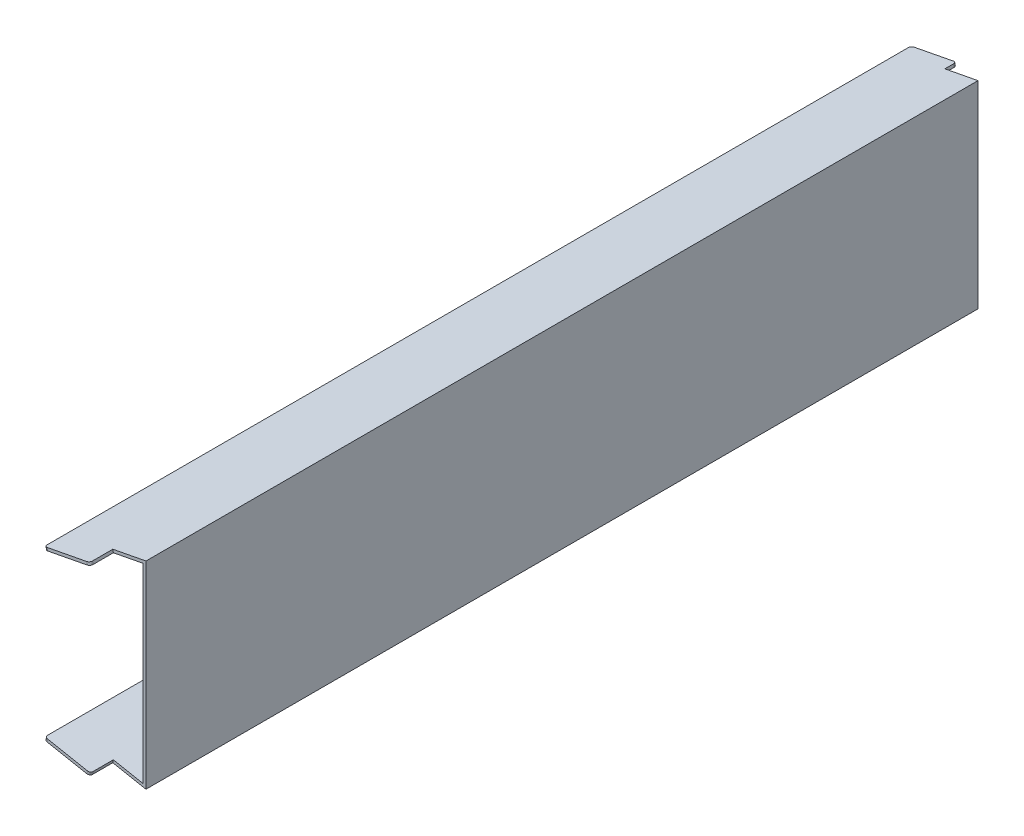
ISO-10303-21;
HEADER;
FILE_DESCRIPTION(('STEP AP214'),'2;1');
FILE_NAME('part.step','',(''),(''),'','','');
FILE_SCHEMA(('AUTOMOTIVE_DESIGN { 1 0 10303 214 1 1 1 1 }'));
ENDSEC;
DATA;
#1=APPLICATION_CONTEXT('core data for automotive mechanical design processes');
#2=APPLICATION_PROTOCOL_DEFINITION('international standard','automotive_design',2000,#1);
#3=PRODUCT_CONTEXT('',#1,'mechanical');
#4=PRODUCT('Part','Part','',(#3));
#5=PRODUCT_RELATED_PRODUCT_CATEGORY('part','',(#4));
#6=PRODUCT_DEFINITION_FORMATION('','',#4);
#7=PRODUCT_DEFINITION_CONTEXT('part definition',#1,'design');
#8=PRODUCT_DEFINITION('design','',#6,#7);
#9=PRODUCT_DEFINITION_SHAPE('','',#8);
#10=(LENGTH_UNIT() NAMED_UNIT(*) SI_UNIT(.MILLI.,.METRE.));
#11=(NAMED_UNIT(*) PLANE_ANGLE_UNIT() SI_UNIT($,.RADIAN.));
#12=(NAMED_UNIT(*) SI_UNIT($,.STERADIAN.) SOLID_ANGLE_UNIT());
#13=UNCERTAINTY_MEASURE_WITH_UNIT(LENGTH_MEASURE(1.E-05),#10,'distance_accuracy_value','');
#14=(GEOMETRIC_REPRESENTATION_CONTEXT(3) GLOBAL_UNCERTAINTY_ASSIGNED_CONTEXT((#13)) GLOBAL_UNIT_ASSIGNED_CONTEXT((#10,
#11,#12)) REPRESENTATION_CONTEXT('',''));
#15=CARTESIAN_POINT('',(0.,0.,0.));
#16=DIRECTION('',(0.,0.,1.));
#17=DIRECTION('',(1.,0.,0.));
#18=AXIS2_PLACEMENT_3D('',#15,#16,#17);
#19=CARTESIAN_POINT('',(0.,0.,144.));
#20=DIRECTION('',(0.,0.,1.));
#21=DIRECTION('',(1.,0.,0.));
#22=AXIS2_PLACEMENT_3D('',#19,#20,#21);
#23=PLANE('',#22);
#24=DIRECTION('',(-0.982006446980647,0.188847393650124,0.));
#25=VECTOR('',#24,1.);
#26=CARTESIAN_POINT('',(-13.,2.5,144.));
#27=LINE('',#26,#25);
#28=CARTESIAN_POINT('',(0.,0.,144.));
#29=VERTEX_POINT('',#28);
#30=CARTESIAN_POINT('',(-5.14394842415484,0.989220850799007,144.));
#31=VERTEX_POINT('',#30);
#32=EDGE_CURVE('E75',#29,#31,#27,.T.);
#33=ORIENTED_EDGE('',*,*,#32,.T.);
#34=DIRECTION('',(-0.188847393650124,-0.982006446980648,0.));
#35=VECTOR('',#34,1.);
#36=CARTESIAN_POINT('',(-5.14394842415484,0.989220850799007,144.));
#37=LINE('',#36,#35);
#38=CARTESIAN_POINT('',(-5.2383721209799,0.498217627308683,144.));
#39=VERTEX_POINT('',#38);
#40=EDGE_CURVE('E290',#31,#39,#37,.T.);
#41=ORIENTED_EDGE('',*,*,#40,.T.);
#42=DIRECTION('',(0.982006446980647,-0.188847393650124,0.));
#43=VECTOR('',#42,1.);
#44=CARTESIAN_POINT('',(-13.0944236968251,2.00899677650967,144.));
#45=LINE('',#44,#43);
#46=CARTESIAN_POINT('',(0.5,-0.605315472879758,144.));
#47=VERTEX_POINT('',#46);
#48=EDGE_CURVE('E373',#39,#47,#45,.T.);
#49=ORIENTED_EDGE('',*,*,#48,.T.);
#50=DIRECTION('',(0.,1.,0.));
#51=VECTOR('',#50,1.);
#52=CARTESIAN_POINT('',(0.5,-0.605315472879758,144.));
#53=LINE('',#52,#51);
#54=CARTESIAN_POINT('',(0.5,33.6053154728798,144.));
#55=VERTEX_POINT('',#54);
#56=EDGE_CURVE('E386',#47,#55,#53,.T.);
#57=ORIENTED_EDGE('',*,*,#56,.T.);
#58=DIRECTION('',(-0.982006446980647,-0.188847393650125,0.));
#59=VECTOR('',#58,1.);
#60=CARTESIAN_POINT('',(0.5,33.6053154728798,144.));
#61=LINE('',#60,#59);
#62=CARTESIAN_POINT('',(-5.23837212097989,32.5017823726913,144.));
#63=VERTEX_POINT('',#62);
#64=EDGE_CURVE('E384',#55,#63,#61,.T.);
#65=ORIENTED_EDGE('',*,*,#64,.T.);
#66=DIRECTION('',(-0.188847393650125,0.982006446980647,0.));
#67=VECTOR('',#66,1.);
#68=CARTESIAN_POINT('',(-5.14394842415483,32.010779149201,144.));
#69=LINE('',#68,#67);
#70=CARTESIAN_POINT('',(-5.14394842415482,32.010779149201,144.));
#71=VERTEX_POINT('',#70);
#72=EDGE_CURVE('E317',#71,#63,#69,.T.);
#73=ORIENTED_EDGE('',*,*,#72,.F.);
#74=DIRECTION('',(0.982006446980647,0.188847393650124,0.));
#75=VECTOR('',#74,1.);
#76=CARTESIAN_POINT('',(0.,33.,144.));
#77=LINE('',#76,#75);
#78=CARTESIAN_POINT('',(0.,33.,144.));
#79=VERTEX_POINT('',#78);
#80=EDGE_CURVE('E322',#71,#79,#77,.T.);
#81=ORIENTED_EDGE('',*,*,#80,.T.);
#82=DIRECTION('',(0.,-1.,0.));
#83=VECTOR('',#82,1.);
#84=CARTESIAN_POINT('',(0.,0.,144.));
#85=LINE('',#84,#83);
#86=EDGE_CURVE('E390',#79,#29,#85,.T.);
#87=ORIENTED_EDGE('',*,*,#86,.T.);
#88=EDGE_LOOP('',(#33,#41,#49,#57,#65,#73,#81,#87));
#89=FACE_BOUND('',#88,.T.);
#90=ADVANCED_FACE('F50',(#89),#23,.T.);
#91=CARTESIAN_POINT('',(-13.,2.5,144.));
#92=DIRECTION('',(0.982006446980647,-0.188847393650125,0.));
#93=DIRECTION('',(0.188847393650125,0.982006446980647,0.));
#94=AXIS2_PLACEMENT_3D('',#91,#92,#93);
#95=PLANE('',#94);
#96=DIRECTION('',(0.,0.,-1.));
#97=VECTOR('',#96,1.);
#98=CARTESIAN_POINT('',(-13.,2.5,144.));
#99=LINE('',#98,#97);
#100=CARTESIAN_POINT('',(-13.,2.5,147.5));
#101=VERTEX_POINT('',#100);
#102=CARTESIAN_POINT('',(-13.,2.5,-1.5));
#103=VERTEX_POINT('',#102);
#104=EDGE_CURVE('E214',#101,#103,#99,.T.);
#105=ORIENTED_EDGE('',*,*,#104,.T.);
#106=DIRECTION('',(-0.188847393650124,-0.982006446980648,0.));
#107=VECTOR('',#106,1.);
#108=CARTESIAN_POINT('',(-13.,2.5,-1.5));
#109=LINE('',#108,#107);
#110=CARTESIAN_POINT('',(-13.0944236968251,2.00899677650967,-1.5));
#111=VERTEX_POINT('',#110);
#112=EDGE_CURVE('E216',#103,#111,#109,.T.);
#113=ORIENTED_EDGE('',*,*,#112,.T.);
#114=DIRECTION('',(0.,0.,-1.));
#115=VECTOR('',#114,1.);
#116=CARTESIAN_POINT('',(-13.0944236968251,2.00899677650967,144.));
#117=LINE('',#116,#115);
#118=CARTESIAN_POINT('',(-13.0944236968251,2.00899677650967,147.5));
#119=VERTEX_POINT('',#118);
#120=EDGE_CURVE('E13',#119,#111,#117,.T.);
#121=ORIENTED_EDGE('',*,*,#120,.F.);
#122=DIRECTION('',(-0.188847393650124,-0.982006446980648,0.));
#123=VECTOR('',#122,1.);
#124=CARTESIAN_POINT('',(-13.,2.5,147.5));
#125=LINE('',#124,#123);
#126=EDGE_CURVE('E219',#101,#119,#125,.T.);
#127=ORIENTED_EDGE('',*,*,#126,.F.);
#128=EDGE_LOOP('',(#105,#113,#121,#127));
#129=FACE_BOUND('',#128,.T.);
#130=ADVANCED_FACE('F52',(#129),#95,.F.);
#131=CARTESIAN_POINT('',(-13.0944236968251,2.00899677650967,144.));
#132=DIRECTION('',(0.188847393650124,0.982006446980647,0.));
#133=DIRECTION('',(-0.982006446980648,0.188847393650124,0.));
#134=AXIS2_PLACEMENT_3D('',#131,#132,#133);
#135=PLANE('',#134);
#136=ORIENTED_EDGE('',*,*,#120,.T.);
#137=CARTESIAN_POINT('',(-12.6034204733347,1.9145730796846,-1.5));
#138=DIRECTION('',(-0.188847393650124,-0.982006446980647,0.));
#139=DIRECTION('',(0.982006446980648,-0.188847393650124,0.));
#140=AXIS2_PLACEMENT_3D('',#137,#138,#139);
#141=CIRCLE('',#140,0.5);
#142=CARTESIAN_POINT('',(-12.6034204733347,1.91457307968462,-2.));
#143=VERTEX_POINT('',#142);
#144=EDGE_CURVE('E231',#111,#143,#141,.T.);
#145=ORIENTED_EDGE('',*,*,#144,.T.);
#146=DIRECTION('',(0.982006446980648,-0.188847393650124,0.));
#147=VECTOR('',#146,1.);
#148=CARTESIAN_POINT('',(-0.0944236968250623,-0.491003223490324,-2.));
#149=LINE('',#148,#147);
#150=CARTESIAN_POINT('',(-5.72937534447021,0.592641324133751,-2.));
#151=VERTEX_POINT('',#150);
#152=EDGE_CURVE('E251',#143,#151,#149,.T.);
#153=ORIENTED_EDGE('',*,*,#152,.T.);
#154=CARTESIAN_POINT('',(-5.72937534447021,0.592641324133732,-1.5));
#155=DIRECTION('',(-0.188847393650124,-0.982006446980647,0.));
#156=DIRECTION('',(0.982006446980648,-0.188847393650124,0.));
#157=AXIS2_PLACEMENT_3D('',#154,#155,#156);
#158=CIRCLE('',#157,0.5);
#159=CARTESIAN_POINT('',(-5.23837212097988,0.498217627308679,-1.5));
#160=VERTEX_POINT('',#159);
#161=EDGE_CURVE('E244',#151,#160,#158,.T.);
#162=ORIENTED_EDGE('',*,*,#161,.T.);
#163=DIRECTION('',(0.,0.,1.));
#164=VECTOR('',#163,1.);
#165=CARTESIAN_POINT('',(-5.23837212097988,0.498217627308679,0.));
#166=LINE('',#165,#164);
#167=CARTESIAN_POINT('',(-5.23837212097989,0.49821762730868,0.));
#168=VERTEX_POINT('',#167);
#169=EDGE_CURVE('E67',#160,#168,#166,.T.);
#170=ORIENTED_EDGE('',*,*,#169,.T.);
#171=DIRECTION('',(0.982006446980647,-0.188847393650124,0.));
#172=VECTOR('',#171,1.);
#173=CARTESIAN_POINT('',(-13.0944236968251,2.00899677650967,0.));
#174=LINE('',#173,#172);
#175=CARTESIAN_POINT('',(0.5,-0.605315472879758,0.));
#176=VERTEX_POINT('',#175);
#177=EDGE_CURVE('E364',#168,#176,#174,.T.);
#178=ORIENTED_EDGE('',*,*,#177,.T.);
#179=DIRECTION('',(0.,0.,-1.));
#180=VECTOR('',#179,1.);
#181=CARTESIAN_POINT('',(0.5,-0.605315472879758,144.));
#182=LINE('',#181,#180);
#183=EDGE_CURVE('E59',#47,#176,#182,.T.);
#184=ORIENTED_EDGE('',*,*,#183,.F.);
#185=ORIENTED_EDGE('',*,*,#48,.F.);
#186=DIRECTION('',(0.,0.,-1.));
#187=VECTOR('',#186,1.);
#188=CARTESIAN_POINT('',(-5.23837212097979,0.498217627308661,0.));
#189=LINE('',#188,#187);
#190=CARTESIAN_POINT('',(-5.2383721209799,0.498217627308682,147.5));
#191=VERTEX_POINT('',#190);
#192=EDGE_CURVE('E274',#191,#39,#189,.T.);
#193=ORIENTED_EDGE('',*,*,#192,.F.);
#194=CARTESIAN_POINT('',(-5.72937534447023,0.592641324133739,147.5));
#195=DIRECTION('',(-0.188847393650124,-0.982006446980647,0.));
#196=DIRECTION('',(0.982006446980648,-0.188847393650124,0.));
#197=AXIS2_PLACEMENT_3D('',#194,#195,#196);
#198=CIRCLE('',#197,0.5);
#199=CARTESIAN_POINT('',(-5.72937534447023,0.592641324133756,148.));
#200=VERTEX_POINT('',#199);
#201=EDGE_CURVE('E277',#200,#191,#198,.F.);
#202=ORIENTED_EDGE('',*,*,#201,.F.);
#203=DIRECTION('',(0.982006446980648,-0.188847393650124,0.));
#204=VECTOR('',#203,1.);
#205=CARTESIAN_POINT('',(-0.0944236968250623,-0.491003223490324,148.));
#206=LINE('',#205,#204);
#207=CARTESIAN_POINT('',(-12.6034204733347,1.91457307968462,148.));
#208=VERTEX_POINT('',#207);
#209=EDGE_CURVE('E266',#208,#200,#206,.T.);
#210=ORIENTED_EDGE('',*,*,#209,.F.);
#211=CARTESIAN_POINT('',(-12.6034204733347,1.9145730796846,147.5));
#212=DIRECTION('',(-0.188847393650124,-0.982006446980647,0.));
#213=DIRECTION('',(0.982006446980648,-0.188847393650124,0.));
#214=AXIS2_PLACEMENT_3D('',#211,#212,#213);
#215=CIRCLE('',#214,0.5);
#216=EDGE_CURVE('E257',#119,#208,#215,.F.);
#217=ORIENTED_EDGE('',*,*,#216,.F.);
#218=EDGE_LOOP('',(#136,#145,#153,#162,#170,#178,#184,#185,#193,#202,#210,#217));
#219=FACE_BOUND('',#218,.T.);
#220=ADVANCED_FACE('F447',(#219),#135,.F.);
#221=CARTESIAN_POINT('',(0.5,-0.605315472879758,144.));
#222=DIRECTION('',(-1.,0.,0.));
#223=DIRECTION('',(0.,-1.,0.));
#224=AXIS2_PLACEMENT_3D('',#221,#222,#223);
#225=PLANE('',#224);
#226=DIRECTION('',(0.,1.,0.));
#227=VECTOR('',#226,1.);
#228=CARTESIAN_POINT('',(0.5,-0.605315472879758,0.));
#229=LINE('',#228,#227);
#230=CARTESIAN_POINT('',(0.5,33.6053154728798,0.));
#231=VERTEX_POINT('',#230);
#232=EDGE_CURVE('E394',#176,#231,#229,.T.);
#233=ORIENTED_EDGE('',*,*,#232,.T.);
#234=DIRECTION('',(0.,0.,-1.));
#235=VECTOR('',#234,1.);
#236=CARTESIAN_POINT('',(0.5,33.6053154728798,144.));
#237=LINE('',#236,#235);
#238=EDGE_CURVE('E438',#55,#231,#237,.T.);
#239=ORIENTED_EDGE('',*,*,#238,.F.);
#240=ORIENTED_EDGE('',*,*,#56,.F.);
#241=ORIENTED_EDGE('',*,*,#183,.T.);
#242=EDGE_LOOP('',(#233,#239,#240,#241));
#243=FACE_BOUND('',#242,.T.);
#244=ADVANCED_FACE('F444',(#243),#225,.F.);
#245=CARTESIAN_POINT('',(0.5,33.6053154728798,144.));
#246=DIRECTION('',(0.188847393650125,-0.982006446980647,0.));
#247=DIRECTION('',(0.982006446980647,0.188847393650125,0.));
#248=AXIS2_PLACEMENT_3D('',#245,#246,#247);
#249=PLANE('',#248);
#250=DIRECTION('',(-0.982006446980647,-0.188847393650125,0.));
#251=VECTOR('',#250,1.);
#252=CARTESIAN_POINT('',(0.5,33.6053154728798,0.));
#253=LINE('',#252,#251);
#254=CARTESIAN_POINT('',(-5.23837212097989,32.5017823726913,0.));
#255=VERTEX_POINT('',#254);
#256=EDGE_CURVE('E396',#231,#255,#253,.T.);
#257=ORIENTED_EDGE('',*,*,#256,.T.);
#258=DIRECTION('',(0.,0.,-1.));
#259=VECTOR('',#258,1.);
#260=CARTESIAN_POINT('',(-5.23837212097989,32.5017823726913,-1.5));
#261=LINE('',#260,#259);
#262=CARTESIAN_POINT('',(-5.23837212097989,32.5017823726913,-1.5));
#263=VERTEX_POINT('',#262);
#264=EDGE_CURVE('E321',#255,#263,#261,.T.);
#265=ORIENTED_EDGE('',*,*,#264,.T.);
#266=CARTESIAN_POINT('',(-5.72937534447021,32.4073586758663,-1.5));
#267=DIRECTION('',(-0.188847393650125,0.982006446980647,0.));
#268=DIRECTION('',(0.982006446980647,0.188847393650125,0.));
#269=AXIS2_PLACEMENT_3D('',#266,#267,#268);
#270=CIRCLE('',#269,0.5);
#271=CARTESIAN_POINT('',(-5.72937534447021,32.4073586758663,-2.));
#272=VERTEX_POINT('',#271);
#273=EDGE_CURVE('E352',#263,#272,#270,.T.);
#274=ORIENTED_EDGE('',*,*,#273,.T.);
#275=DIRECTION('',(-0.982006446980647,-0.188847393650124,0.));
#276=VECTOR('',#275,1.);
#277=CARTESIAN_POINT('',(-12.6034204733347,31.0854269203154,-2.));
#278=LINE('',#277,#276);
#279=CARTESIAN_POINT('',(-12.6034204733347,31.0854269203154,-2.));
#280=VERTEX_POINT('',#279);
#281=EDGE_CURVE('E355',#272,#280,#278,.T.);
#282=ORIENTED_EDGE('',*,*,#281,.T.);
#283=CARTESIAN_POINT('',(-12.6034204733347,31.0854269203154,-1.5));
#284=DIRECTION('',(-0.188847393650125,0.982006446980647,0.));
#285=DIRECTION('',(0.982006446980647,0.188847393650125,0.));
#286=AXIS2_PLACEMENT_3D('',#283,#284,#285);
#287=CIRCLE('',#286,0.5);
#288=CARTESIAN_POINT('',(-13.0944236968251,30.9910032234903,-1.5));
#289=VERTEX_POINT('',#288);
#290=EDGE_CURVE('E358',#280,#289,#287,.T.);
#291=ORIENTED_EDGE('',*,*,#290,.T.);
#292=DIRECTION('',(0.,0.,-1.));
#293=VECTOR('',#292,1.);
#294=CARTESIAN_POINT('',(-13.0944236968251,30.9910032234903,144.));
#295=LINE('',#294,#293);
#296=CARTESIAN_POINT('',(-13.0944236968251,30.9910032234903,147.5));
#297=VERTEX_POINT('',#296);
#298=EDGE_CURVE('E436',#297,#289,#295,.T.);
#299=ORIENTED_EDGE('',*,*,#298,.F.);
#300=CARTESIAN_POINT('',(-12.6034204733347,31.0854269203154,147.5));
#301=DIRECTION('',(-0.188847393650125,0.982006446980647,0.));
#302=DIRECTION('',(-0.982006446980647,-0.188847393650125,0.));
#303=AXIS2_PLACEMENT_3D('',#300,#301,#302);
#304=CIRCLE('',#303,0.5);
#305=CARTESIAN_POINT('',(-12.6034204733347,31.0854269203154,148.));
#306=VERTEX_POINT('',#305);
#307=EDGE_CURVE('E283',#297,#306,#304,.T.);
#308=ORIENTED_EDGE('',*,*,#307,.T.);
#309=DIRECTION('',(0.982006446980647,0.188847393650125,0.));
#310=VECTOR('',#309,1.);
#311=CARTESIAN_POINT('',(-12.6034204733347,31.0854269203154,148.));
#312=LINE('',#311,#310);
#313=CARTESIAN_POINT('',(-5.72937534447021,32.4073586758663,148.));
#314=VERTEX_POINT('',#313);
#315=EDGE_CURVE('E306',#306,#314,#312,.T.);
#316=ORIENTED_EDGE('',*,*,#315,.T.);
#317=CARTESIAN_POINT('',(-5.72937534447021,32.4073586758663,147.5));
#318=DIRECTION('',(-0.188847393650125,0.982006446980647,0.));
#319=DIRECTION('',(-0.982006446980647,-0.188847393650125,0.));
#320=AXIS2_PLACEMENT_3D('',#317,#318,#319);
#321=CIRCLE('',#320,0.500000000000001);
#322=CARTESIAN_POINT('',(-5.23837212097989,32.5017823726913,147.5));
#323=VERTEX_POINT('',#322);
#324=EDGE_CURVE('E309',#314,#323,#321,.T.);
#325=ORIENTED_EDGE('',*,*,#324,.T.);
#326=DIRECTION('',(0.,0.,-1.));
#327=VECTOR('',#326,1.);
#328=CARTESIAN_POINT('',(-5.23837212097989,32.5017823726913,147.5));
#329=LINE('',#328,#327);
#330=EDGE_CURVE('E297',#323,#63,#329,.T.);
#331=ORIENTED_EDGE('',*,*,#330,.T.);
#332=ORIENTED_EDGE('',*,*,#64,.F.);
#333=ORIENTED_EDGE('',*,*,#238,.T.);
#334=EDGE_LOOP('',(#257,#265,#274,#282,#291,#299,#308,#316,#325,#331,#332,#333));
#335=FACE_BOUND('',#334,.T.);
#336=ADVANCED_FACE('F407',(#335),#249,.F.);
#337=CARTESIAN_POINT('',(-13.0944236968251,30.9910032234903,144.));
#338=DIRECTION('',(0.982006446980646,0.188847393650131,0.));
#339=DIRECTION('',(-0.188847393650131,0.982006446980646,0.));
#340=AXIS2_PLACEMENT_3D('',#337,#338,#339);
#341=PLANE('',#340);
#342=ORIENTED_EDGE('',*,*,#298,.T.);
#343=DIRECTION('',(-0.188847393650125,0.982006446980647,0.));
#344=VECTOR('',#343,1.);
#345=CARTESIAN_POINT('',(-13.,30.5,-1.5));
#346=LINE('',#345,#344);
#347=CARTESIAN_POINT('',(-13.,30.5,-1.5));
#348=VERTEX_POINT('',#347);
#349=EDGE_CURVE('E361',#348,#289,#346,.T.);
#350=ORIENTED_EDGE('',*,*,#349,.F.);
#351=DIRECTION('',(0.,0.,-1.));
#352=VECTOR('',#351,1.);
#353=CARTESIAN_POINT('',(-13.,30.5,144.));
#354=LINE('',#353,#352);
#355=CARTESIAN_POINT('',(-13.,30.5,147.5));
#356=VERTEX_POINT('',#355);
#357=EDGE_CURVE('E434',#356,#348,#354,.T.);
#358=ORIENTED_EDGE('',*,*,#357,.F.);
#359=DIRECTION('',(-0.188847393650125,0.982006446980647,0.));
#360=VECTOR('',#359,1.);
#361=CARTESIAN_POINT('',(-13.,30.5,147.5));
#362=LINE('',#361,#360);
#363=EDGE_CURVE('E329',#356,#297,#362,.T.);
#364=ORIENTED_EDGE('',*,*,#363,.T.);
#365=EDGE_LOOP('',(#342,#350,#358,#364));
#366=FACE_BOUND('',#365,.T.);
#367=ADVANCED_FACE('F473',(#366),#341,.F.);
#368=CARTESIAN_POINT('',(0.,33.,144.));
#369=DIRECTION('',(-0.188847393650124,0.982006446980647,0.));
#370=DIRECTION('',(-0.982006446980648,-0.188847393650124,0.));
#371=AXIS2_PLACEMENT_3D('',#368,#369,#370);
#372=PLANE('',#371);
#373=ORIENTED_EDGE('',*,*,#357,.T.);
#374=CARTESIAN_POINT('',(-12.5089967765097,30.5944236968251,-1.5));
#375=DIRECTION('',(-0.188847393650125,0.982006446980647,0.));
#376=DIRECTION('',(0.982006446980647,0.188847393650125,0.));
#377=AXIS2_PLACEMENT_3D('',#374,#375,#376);
#378=CIRCLE('',#377,0.5);
#379=CARTESIAN_POINT('',(-12.5089967765097,30.5944236968251,-2.));
#380=VERTEX_POINT('',#379);
#381=EDGE_CURVE('E348',#380,#348,#378,.T.);
#382=ORIENTED_EDGE('',*,*,#381,.F.);
#383=DIRECTION('',(-0.982006446980647,-0.188847393650124,0.));
#384=VECTOR('',#383,1.);
#385=CARTESIAN_POINT('',(-12.5089967765097,30.5944236968251,-2.));
#386=LINE('',#385,#384);
#387=CARTESIAN_POINT('',(-5.63495164764515,31.9163554523759,-2.));
#388=VERTEX_POINT('',#387);
#389=EDGE_CURVE('E344',#388,#380,#386,.T.);
#390=ORIENTED_EDGE('',*,*,#389,.F.);
#391=CARTESIAN_POINT('',(-5.63495164764515,31.9163554523759,-1.5));
#392=DIRECTION('',(-0.188847393650125,0.982006446980647,0.));
#393=DIRECTION('',(0.982006446980647,0.188847393650125,0.));
#394=AXIS2_PLACEMENT_3D('',#391,#392,#393);
#395=CIRCLE('',#394,0.5);
#396=CARTESIAN_POINT('',(-5.14394842415483,32.010779149201,-1.5));
#397=VERTEX_POINT('',#396);
#398=EDGE_CURVE('E341',#397,#388,#395,.T.);
#399=ORIENTED_EDGE('',*,*,#398,.F.);
#400=DIRECTION('',(0.,0.,-1.));
#401=VECTOR('',#400,1.);
#402=CARTESIAN_POINT('',(-5.14394842415483,32.010779149201,-1.5));
#403=LINE('',#402,#401);
#404=CARTESIAN_POINT('',(-5.14394842415482,32.010779149201,0.));
#405=VERTEX_POINT('',#404);
#406=EDGE_CURVE('E345',#405,#397,#403,.T.);
#407=ORIENTED_EDGE('',*,*,#406,.F.);
#408=DIRECTION('',(0.982006446980647,0.188847393650124,0.));
#409=VECTOR('',#408,1.);
#410=CARTESIAN_POINT('',(0.,33.,0.));
#411=LINE('',#410,#409);
#412=CARTESIAN_POINT('',(0.,33.,0.));
#413=VERTEX_POINT('',#412);
#414=EDGE_CURVE('E404',#405,#413,#411,.T.);
#415=ORIENTED_EDGE('',*,*,#414,.T.);
#416=DIRECTION('',(0.,0.,-1.));
#417=VECTOR('',#416,1.);
#418=CARTESIAN_POINT('',(0.,33.,144.));
#419=LINE('',#418,#417);
#420=EDGE_CURVE('E432',#79,#413,#419,.T.);
#421=ORIENTED_EDGE('',*,*,#420,.F.);
#422=ORIENTED_EDGE('',*,*,#80,.F.);
#423=DIRECTION('',(0.,0.,-1.));
#424=VECTOR('',#423,1.);
#425=CARTESIAN_POINT('',(-5.14394842415483,32.010779149201,147.5));
#426=LINE('',#425,#424);
#427=CARTESIAN_POINT('',(-5.14394842415482,32.010779149201,147.5));
#428=VERTEX_POINT('',#427);
#429=EDGE_CURVE('E303',#428,#71,#426,.T.);
#430=ORIENTED_EDGE('',*,*,#429,.F.);
#431=CARTESIAN_POINT('',(-5.63495164764515,31.9163554523759,147.5));
#432=DIRECTION('',(-0.188847393650125,0.982006446980647,0.));
#433=DIRECTION('',(-0.982006446980647,-0.188847393650125,0.));
#434=AXIS2_PLACEMENT_3D('',#431,#432,#433);
#435=CIRCLE('',#434,0.500000000000001);
#436=CARTESIAN_POINT('',(-5.63495164764515,31.9163554523759,148.));
#437=VERTEX_POINT('',#436);
#438=EDGE_CURVE('E300',#437,#428,#435,.T.);
#439=ORIENTED_EDGE('',*,*,#438,.F.);
#440=DIRECTION('',(0.982006446980647,0.188847393650125,0.));
#441=VECTOR('',#440,1.);
#442=CARTESIAN_POINT('',(-12.5089967765097,30.5944236968251,148.));
#443=LINE('',#442,#441);
#444=CARTESIAN_POINT('',(-12.5089967765097,30.5944236968251,148.));
#445=VERTEX_POINT('',#444);
#446=EDGE_CURVE('E296',#445,#437,#443,.T.);
#447=ORIENTED_EDGE('',*,*,#446,.F.);
#448=CARTESIAN_POINT('',(-12.5089967765097,30.5944236968251,147.5));
#449=DIRECTION('',(-0.188847393650125,0.982006446980647,0.));
#450=DIRECTION('',(-0.982006446980647,-0.188847393650125,0.));
#451=AXIS2_PLACEMENT_3D('',#448,#449,#450);
#452=CIRCLE('',#451,0.5);
#453=EDGE_CURVE('E293',#356,#445,#452,.T.);
#454=ORIENTED_EDGE('',*,*,#453,.F.);
#455=EDGE_LOOP('',(#373,#382,#390,#399,#407,#415,#421,#422,#430,#439,#447,#454));
#456=FACE_BOUND('',#455,.T.);
#457=ADVANCED_FACE('F470',(#456),#372,.F.);
#458=CARTESIAN_POINT('',(0.,0.,144.));
#459=DIRECTION('',(1.,0.,0.));
#460=DIRECTION('',(0.,0.,-1.));
#461=AXIS2_PLACEMENT_3D('',#458,#459,#460);
#462=PLANE('',#461);
#463=DIRECTION('',(0.,-1.,0.));
#464=VECTOR('',#463,1.);
#465=CARTESIAN_POINT('',(0.,0.,0.));
#466=LINE('',#465,#464);
#467=CARTESIAN_POINT('',(0.,0.,0.));
#468=VERTEX_POINT('',#467);
#469=EDGE_CURVE('E421',#413,#468,#466,.T.);
#470=ORIENTED_EDGE('',*,*,#469,.T.);
#471=DIRECTION('',(0.,0.,-1.));
#472=VECTOR('',#471,1.);
#473=CARTESIAN_POINT('',(0.,0.,144.));
#474=LINE('',#473,#472);
#475=EDGE_CURVE('E224',#29,#468,#474,.T.);
#476=ORIENTED_EDGE('',*,*,#475,.F.);
#477=ORIENTED_EDGE('',*,*,#86,.F.);
#478=ORIENTED_EDGE('',*,*,#420,.T.);
#479=EDGE_LOOP('',(#470,#476,#477,#478));
#480=FACE_BOUND('',#479,.T.);
#481=ADVANCED_FACE('F467',(#480),#462,.F.);
#482=CARTESIAN_POINT('',(-13.,2.5,144.));
#483=DIRECTION('',(-0.188847393650124,-0.982006446980647,0.));
#484=DIRECTION('',(0.982006446980648,-0.188847393650124,0.));
#485=AXIS2_PLACEMENT_3D('',#482,#483,#484);
#486=PLANE('',#485);
#487=DIRECTION('',(-0.982006446980647,0.188847393650124,0.));
#488=VECTOR('',#487,1.);
#489=CARTESIAN_POINT('',(-13.,2.5,0.));
#490=LINE('',#489,#488);
#491=CARTESIAN_POINT('',(-5.14394842415482,0.989220850799003,0.));
#492=VERTEX_POINT('',#491);
#493=EDGE_CURVE('E425',#468,#492,#490,.T.);
#494=ORIENTED_EDGE('',*,*,#493,.T.);
#495=DIRECTION('',(0.,0.,1.));
#496=VECTOR('',#495,1.);
#497=CARTESIAN_POINT('',(-5.14394842415482,0.989220850799003,0.));
#498=LINE('',#497,#496);
#499=CARTESIAN_POINT('',(-5.14394842415482,0.989220850799003,-1.5));
#500=VERTEX_POINT('',#499);
#501=EDGE_CURVE('E233',#500,#492,#498,.T.);
#502=ORIENTED_EDGE('',*,*,#501,.F.);
#503=CARTESIAN_POINT('',(-5.63495164764515,1.08364454762406,-1.5));
#504=DIRECTION('',(-0.188847393650124,-0.982006446980647,0.));
#505=DIRECTION('',(0.982006446980648,-0.188847393650124,0.));
#506=AXIS2_PLACEMENT_3D('',#503,#504,#505);
#507=CIRCLE('',#506,0.5);
#508=CARTESIAN_POINT('',(-5.63495164764515,1.08364454762407,-2.));
#509=VERTEX_POINT('',#508);
#510=EDGE_CURVE('E242',#509,#500,#507,.T.);
#511=ORIENTED_EDGE('',*,*,#510,.F.);
#512=DIRECTION('',(0.982006446980648,-0.188847393650124,0.));
#513=VECTOR('',#512,1.);
#514=CARTESIAN_POINT('',(0.,0.,-2.));
#515=LINE('',#514,#513);
#516=CARTESIAN_POINT('',(-12.5089967765097,2.40557630317494,-2.));
#517=VERTEX_POINT('',#516);
#518=EDGE_CURVE('E240',#517,#509,#515,.T.);
#519=ORIENTED_EDGE('',*,*,#518,.F.);
#520=CARTESIAN_POINT('',(-12.5089967765097,2.40557630317493,-1.5));
#521=DIRECTION('',(-0.188847393650124,-0.982006446980647,0.));
#522=DIRECTION('',(0.982006446980648,-0.188847393650124,0.));
#523=AXIS2_PLACEMENT_3D('',#520,#521,#522);
#524=CIRCLE('',#523,0.5);
#525=EDGE_CURVE('E229',#103,#517,#524,.T.);
#526=ORIENTED_EDGE('',*,*,#525,.F.);
#527=ORIENTED_EDGE('',*,*,#104,.F.);
#528=CARTESIAN_POINT('',(-12.5089967765097,2.40557630317493,147.5));
#529=DIRECTION('',(-0.188847393650124,-0.982006446980647,0.));
#530=DIRECTION('',(0.982006446980648,-0.188847393650124,0.));
#531=AXIS2_PLACEMENT_3D('',#528,#529,#530);
#532=CIRCLE('',#531,0.5);
#533=CARTESIAN_POINT('',(-12.5089967765097,2.40557630317494,148.));
#534=VERTEX_POINT('',#533);
#535=EDGE_CURVE('E263',#101,#534,#532,.F.);
#536=ORIENTED_EDGE('',*,*,#535,.T.);
#537=DIRECTION('',(0.982006446980648,-0.188847393650124,0.));
#538=VECTOR('',#537,1.);
#539=CARTESIAN_POINT('',(0.,0.,148.));
#540=LINE('',#539,#538);
#541=CARTESIAN_POINT('',(-5.63495164764517,1.08364454762408,148.));
#542=VERTEX_POINT('',#541);
#543=EDGE_CURVE('E270',#534,#542,#540,.T.);
#544=ORIENTED_EDGE('',*,*,#543,.T.);
#545=CARTESIAN_POINT('',(-5.63495164764516,1.08364454762406,147.5));
#546=DIRECTION('',(-0.188847393650124,-0.982006446980647,0.));
#547=DIRECTION('',(0.982006446980648,-0.188847393650124,0.));
#548=AXIS2_PLACEMENT_3D('',#545,#546,#547);
#549=CIRCLE('',#548,0.5);
#550=CARTESIAN_POINT('',(-5.14394842415484,0.989220850799006,147.5));
#551=VERTEX_POINT('',#550);
#552=EDGE_CURVE('E268',#542,#551,#549,.F.);
#553=ORIENTED_EDGE('',*,*,#552,.T.);
#554=DIRECTION('',(0.,0.,-1.));
#555=VECTOR('',#554,1.);
#556=CARTESIAN_POINT('',(-5.14394842415473,0.989220850798985,0.));
#557=LINE('',#556,#555);
#558=EDGE_CURVE('E265',#551,#31,#557,.T.);
#559=ORIENTED_EDGE('',*,*,#558,.T.);
#560=ORIENTED_EDGE('',*,*,#32,.F.);
#561=ORIENTED_EDGE('',*,*,#475,.T.);
#562=EDGE_LOOP('',(#494,#502,#511,#519,#526,#527,#536,#544,#553,#559,#560,#561));
#563=FACE_BOUND('',#562,.T.);
#564=ADVANCED_FACE('F237',(#563),#486,.F.);
#565=CARTESIAN_POINT('',(0.,0.,0.));
#566=DIRECTION('',(0.,0.,1.));
#567=DIRECTION('',(1.,0.,0.));
#568=AXIS2_PLACEMENT_3D('',#565,#566,#567);
#569=PLANE('',#568);
#570=ORIENTED_EDGE('',*,*,#177,.F.);
#571=DIRECTION('',(-0.188847393650124,-0.982006446980648,0.));
#572=VECTOR('',#571,1.);
#573=CARTESIAN_POINT('',(-5.14394842415482,0.989220850799003,0.));
#574=LINE('',#573,#572);
#575=EDGE_CURVE('E255',#492,#168,#574,.T.);
#576=ORIENTED_EDGE('',*,*,#575,.F.);
#577=ORIENTED_EDGE('',*,*,#493,.F.);
#578=ORIENTED_EDGE('',*,*,#469,.F.);
#579=ORIENTED_EDGE('',*,*,#414,.F.);
#580=DIRECTION('',(-0.188847393650125,0.982006446980647,0.));
#581=VECTOR('',#580,1.);
#582=CARTESIAN_POINT('',(-5.14394842415482,32.010779149201,0.));
#583=LINE('',#582,#581);
#584=EDGE_CURVE('E351',#405,#255,#583,.T.);
#585=ORIENTED_EDGE('',*,*,#584,.T.);
#586=ORIENTED_EDGE('',*,*,#256,.F.);
#587=ORIENTED_EDGE('',*,*,#232,.F.);
#588=EDGE_LOOP('',(#570,#576,#577,#578,#579,#585,#586,#587));
#589=FACE_BOUND('',#588,.T.);
#590=ADVANCED_FACE('F417',(#589),#569,.F.);
#591=CARTESIAN_POINT('',(-12.5089967765097,30.5944236968251,-1.5));
#592=DIRECTION('',(-0.188847393650125,0.982006446980647,0.));
#593=DIRECTION('',(-0.982006446980647,-0.188847393650125,0.));
#594=AXIS2_PLACEMENT_3D('',#591,#592,#593);
#595=CYLINDRICAL_SURFACE('',#594,0.5);
#596=ORIENTED_EDGE('',*,*,#290,.F.);
#597=DIRECTION('',(-0.188847393650125,0.982006446980647,0.));
#598=VECTOR('',#597,1.);
#599=CARTESIAN_POINT('',(-12.5089967765097,30.5944236968251,-2.));
#600=LINE('',#599,#598);
#601=EDGE_CURVE('E365',#380,#280,#600,.T.);
#602=ORIENTED_EDGE('',*,*,#601,.F.);
#603=ORIENTED_EDGE('',*,*,#381,.T.);
#604=ORIENTED_EDGE('',*,*,#349,.T.);
#605=EDGE_LOOP('',(#596,#602,#603,#604));
#606=FACE_BOUND('',#605,.T.);
#607=ADVANCED_FACE('F464',(#606),#595,.T.);
#608=CARTESIAN_POINT('',(-12.5089967765097,30.5944236968251,-2.));
#609=DIRECTION('',(0.,0.,-1.));
#610=DIRECTION('',(-1.,0.,0.));
#611=AXIS2_PLACEMENT_3D('',#608,#609,#610);
#612=PLANE('',#611);
#613=ORIENTED_EDGE('',*,*,#281,.F.);
#614=DIRECTION('',(-0.188847393650125,0.982006446980647,0.));
#615=VECTOR('',#614,1.);
#616=CARTESIAN_POINT('',(-5.63495164764515,31.9163554523759,-2.));
#617=LINE('',#616,#615);
#618=EDGE_CURVE('E367',#388,#272,#617,.T.);
#619=ORIENTED_EDGE('',*,*,#618,.F.);
#620=ORIENTED_EDGE('',*,*,#389,.T.);
#621=ORIENTED_EDGE('',*,*,#601,.T.);
#622=EDGE_LOOP('',(#613,#619,#620,#621));
#623=FACE_BOUND('',#622,.T.);
#624=ADVANCED_FACE('F508',(#623),#612,.T.);
#625=CARTESIAN_POINT('',(-5.63495164764515,31.9163554523759,-1.5));
#626=DIRECTION('',(-0.188847393650125,0.982006446980647,0.));
#627=DIRECTION('',(-0.982006446980647,-0.188847393650125,0.));
#628=AXIS2_PLACEMENT_3D('',#625,#626,#627);
#629=CYLINDRICAL_SURFACE('',#628,0.5);
#630=ORIENTED_EDGE('',*,*,#273,.F.);
#631=DIRECTION('',(-0.188847393650125,0.982006446980647,0.));
#632=VECTOR('',#631,1.);
#633=CARTESIAN_POINT('',(-5.14394842415483,32.010779149201,-1.5));
#634=LINE('',#633,#632);
#635=EDGE_CURVE('E369',#397,#263,#634,.T.);
#636=ORIENTED_EDGE('',*,*,#635,.F.);
#637=ORIENTED_EDGE('',*,*,#398,.T.);
#638=ORIENTED_EDGE('',*,*,#618,.T.);
#639=EDGE_LOOP('',(#630,#636,#637,#638));
#640=FACE_BOUND('',#639,.T.);
#641=ADVANCED_FACE('F516',(#640),#629,.T.);
#642=CARTESIAN_POINT('',(-5.14394842415483,32.010779149201,-1.5));
#643=DIRECTION('',(0.982006446980647,0.188847393650125,0.));
#644=DIRECTION('',(-0.188847393650125,0.982006446980647,0.));
#645=AXIS2_PLACEMENT_3D('',#642,#643,#644);
#646=PLANE('',#645);
#647=ORIENTED_EDGE('',*,*,#264,.F.);
#648=ORIENTED_EDGE('',*,*,#584,.F.);
#649=ORIENTED_EDGE('',*,*,#406,.T.);
#650=ORIENTED_EDGE('',*,*,#635,.T.);
#651=EDGE_LOOP('',(#647,#648,#649,#650));
#652=FACE_BOUND('',#651,.T.);
#653=ADVANCED_FACE('F412',(#652),#646,.T.);
#654=CARTESIAN_POINT('',(-5.14394842415483,32.010779149201,147.5));
#655=DIRECTION('',(0.982006446980647,0.188847393650125,0.));
#656=DIRECTION('',(-0.188847393650125,0.982006446980647,0.));
#657=AXIS2_PLACEMENT_3D('',#654,#655,#656);
#658=PLANE('',#657);
#659=ORIENTED_EDGE('',*,*,#330,.F.);
#660=DIRECTION('',(-0.188847393650125,0.982006446980647,0.));
#661=VECTOR('',#660,1.);
#662=CARTESIAN_POINT('',(-5.14394842415482,32.010779149201,147.5));
#663=LINE('',#662,#661);
#664=EDGE_CURVE('E314',#428,#323,#663,.T.);
#665=ORIENTED_EDGE('',*,*,#664,.F.);
#666=ORIENTED_EDGE('',*,*,#429,.T.);
#667=ORIENTED_EDGE('',*,*,#72,.T.);
#668=EDGE_LOOP('',(#659,#665,#666,#667));
#669=FACE_BOUND('',#668,.T.);
#670=ADVANCED_FACE('F530',(#669),#658,.T.);
#671=CARTESIAN_POINT('',(-5.63495164764515,31.9163554523759,147.5));
#672=DIRECTION('',(-0.188847393650125,0.982006446980647,0.));
#673=DIRECTION('',(-0.982006446980647,-0.188847393650125,0.));
#674=AXIS2_PLACEMENT_3D('',#671,#672,#673);
#675=CYLINDRICAL_SURFACE('',#674,0.500000000000001);
#676=ORIENTED_EDGE('',*,*,#324,.F.);
#677=DIRECTION('',(-0.188847393650125,0.982006446980647,0.));
#678=VECTOR('',#677,1.);
#679=CARTESIAN_POINT('',(-5.63495164764515,31.9163554523759,148.));
#680=LINE('',#679,#678);
#681=EDGE_CURVE('E338',#437,#314,#680,.T.);
#682=ORIENTED_EDGE('',*,*,#681,.F.);
#683=ORIENTED_EDGE('',*,*,#438,.T.);
#684=ORIENTED_EDGE('',*,*,#664,.T.);
#685=EDGE_LOOP('',(#676,#682,#683,#684));
#686=FACE_BOUND('',#685,.T.);
#687=ADVANCED_FACE('F536',(#686),#675,.T.);
#688=CARTESIAN_POINT('',(-12.5089967765097,30.5944236968251,148.));
#689=DIRECTION('',(0.,0.,1.));
#690=DIRECTION('',(1.,0.,0.));
#691=AXIS2_PLACEMENT_3D('',#688,#689,#690);
#692=PLANE('',#691);
#693=ORIENTED_EDGE('',*,*,#315,.F.);
#694=DIRECTION('',(-0.188847393650125,0.982006446980647,0.));
#695=VECTOR('',#694,1.);
#696=CARTESIAN_POINT('',(-12.5089967765097,30.5944236968251,148.));
#697=LINE('',#696,#695);
#698=EDGE_CURVE('E333',#445,#306,#697,.T.);
#699=ORIENTED_EDGE('',*,*,#698,.F.);
#700=ORIENTED_EDGE('',*,*,#446,.T.);
#701=ORIENTED_EDGE('',*,*,#681,.T.);
#702=EDGE_LOOP('',(#693,#699,#700,#701));
#703=FACE_BOUND('',#702,.T.);
#704=ADVANCED_FACE('F543',(#703),#692,.T.);
#705=CARTESIAN_POINT('',(-12.5089967765097,30.5944236968251,147.5));
#706=DIRECTION('',(-0.188847393650125,0.982006446980647,0.));
#707=DIRECTION('',(-0.982006446980647,-0.188847393650125,0.));
#708=AXIS2_PLACEMENT_3D('',#705,#706,#707);
#709=CYLINDRICAL_SURFACE('',#708,0.5);
#710=ORIENTED_EDGE('',*,*,#307,.F.);
#711=ORIENTED_EDGE('',*,*,#363,.F.);
#712=ORIENTED_EDGE('',*,*,#453,.T.);
#713=ORIENTED_EDGE('',*,*,#698,.T.);
#714=EDGE_LOOP('',(#710,#711,#712,#713));
#715=FACE_BOUND('',#714,.T.);
#716=ADVANCED_FACE('F551',(#715),#709,.T.);
#717=CARTESIAN_POINT('',(-12.5089967765097,2.40557630317493,147.5));
#718=DIRECTION('',(-0.188847393650124,-0.982006446980648,0.));
#719=DIRECTION('',(0.982006446980647,-0.188847393650124,0.));
#720=AXIS2_PLACEMENT_3D('',#717,#718,#719);
#721=CYLINDRICAL_SURFACE('',#720,0.5);
#722=ORIENTED_EDGE('',*,*,#216,.T.);
#723=DIRECTION('',(-0.188847393650124,-0.982006446980648,0.));
#724=VECTOR('',#723,1.);
#725=CARTESIAN_POINT('',(-12.5089967765097,2.40557630317494,148.));
#726=LINE('',#725,#724);
#727=EDGE_CURVE('E280',#534,#208,#726,.T.);
#728=ORIENTED_EDGE('',*,*,#727,.F.);
#729=ORIENTED_EDGE('',*,*,#535,.F.);
#730=ORIENTED_EDGE('',*,*,#126,.T.);
#731=EDGE_LOOP('',(#722,#728,#729,#730));
#732=FACE_BOUND('',#731,.T.);
#733=ADVANCED_FACE('F559',(#732),#721,.T.);
#734=CARTESIAN_POINT('',(0.,0.,148.));
#735=DIRECTION('',(0.,0.,-1.));
#736=DIRECTION('',(-1.,0.,0.));
#737=AXIS2_PLACEMENT_3D('',#734,#735,#736);
#738=PLANE('',#737);
#739=ORIENTED_EDGE('',*,*,#209,.T.);
#740=DIRECTION('',(-0.188847393650124,-0.982006446980648,0.));
#741=VECTOR('',#740,1.);
#742=CARTESIAN_POINT('',(-5.63495164764517,1.08364454762408,148.));
#743=LINE('',#742,#741);
#744=EDGE_CURVE('E284',#542,#200,#743,.T.);
#745=ORIENTED_EDGE('',*,*,#744,.F.);
#746=ORIENTED_EDGE('',*,*,#543,.F.);
#747=ORIENTED_EDGE('',*,*,#727,.T.);
#748=EDGE_LOOP('',(#739,#745,#746,#747));
#749=FACE_BOUND('',#748,.T.);
#750=ADVANCED_FACE('F566',(#749),#738,.F.);
#751=CARTESIAN_POINT('',(-5.63495164764516,1.08364454762406,147.5));
#752=DIRECTION('',(-0.188847393650124,-0.982006446980648,0.));
#753=DIRECTION('',(0.982006446980647,-0.188847393650124,0.));
#754=AXIS2_PLACEMENT_3D('',#751,#752,#753);
#755=CYLINDRICAL_SURFACE('',#754,0.5);
#756=ORIENTED_EDGE('',*,*,#201,.T.);
#757=DIRECTION('',(-0.188847393650124,-0.982006446980648,0.));
#758=VECTOR('',#757,1.);
#759=CARTESIAN_POINT('',(-5.14394842415484,0.989220850799006,147.5));
#760=LINE('',#759,#758);
#761=EDGE_CURVE('E287',#551,#191,#760,.T.);
#762=ORIENTED_EDGE('',*,*,#761,.F.);
#763=ORIENTED_EDGE('',*,*,#552,.F.);
#764=ORIENTED_EDGE('',*,*,#744,.T.);
#765=EDGE_LOOP('',(#756,#762,#763,#764));
#766=FACE_BOUND('',#765,.T.);
#767=ADVANCED_FACE('F574',(#766),#755,.T.);
#768=CARTESIAN_POINT('',(-5.14394842415473,0.989220850798985,0.));
#769=DIRECTION('',(-0.982006446980648,0.188847393650124,0.));
#770=DIRECTION('',(-0.188847393650124,-0.982006446980647,0.));
#771=AXIS2_PLACEMENT_3D('',#768,#769,#770);
#772=PLANE('',#771);
#773=ORIENTED_EDGE('',*,*,#192,.T.);
#774=ORIENTED_EDGE('',*,*,#40,.F.);
#775=ORIENTED_EDGE('',*,*,#558,.F.);
#776=ORIENTED_EDGE('',*,*,#761,.T.);
#777=EDGE_LOOP('',(#773,#774,#775,#776));
#778=FACE_BOUND('',#777,.T.);
#779=ADVANCED_FACE('F582',(#778),#772,.F.);
#780=CARTESIAN_POINT('',(-5.14394842415482,0.989220850799003,0.));
#781=DIRECTION('',(0.982006446980648,-0.188847393650124,0.));
#782=DIRECTION('',(0.188847393650124,0.982006446980647,0.));
#783=AXIS2_PLACEMENT_3D('',#780,#781,#782);
#784=PLANE('',#783);
#785=ORIENTED_EDGE('',*,*,#169,.F.);
#786=DIRECTION('',(-0.188847393650124,-0.982006446980648,0.));
#787=VECTOR('',#786,1.);
#788=CARTESIAN_POINT('',(-5.14394842415482,0.989220850799003,-1.5));
#789=LINE('',#788,#787);
#790=EDGE_CURVE('E258',#500,#160,#789,.T.);
#791=ORIENTED_EDGE('',*,*,#790,.F.);
#792=ORIENTED_EDGE('',*,*,#501,.T.);
#793=ORIENTED_EDGE('',*,*,#575,.T.);
#794=EDGE_LOOP('',(#785,#791,#792,#793));
#795=FACE_BOUND('',#794,.T.);
#796=ADVANCED_FACE('F590',(#795),#784,.T.);
#797=CARTESIAN_POINT('',(-5.63495164764515,1.08364454762406,-1.5));
#798=DIRECTION('',(-0.188847393650124,-0.982006446980648,0.));
#799=DIRECTION('',(0.982006446980647,-0.188847393650124,0.));
#800=AXIS2_PLACEMENT_3D('',#797,#798,#799);
#801=CYLINDRICAL_SURFACE('',#800,0.5);
#802=ORIENTED_EDGE('',*,*,#161,.F.);
#803=DIRECTION('',(-0.188847393650124,-0.982006446980648,0.));
#804=VECTOR('',#803,1.);
#805=CARTESIAN_POINT('',(-5.63495164764515,1.08364454762407,-2.));
#806=LINE('',#805,#804);
#807=EDGE_CURVE('E260',#509,#151,#806,.T.);
#808=ORIENTED_EDGE('',*,*,#807,.F.);
#809=ORIENTED_EDGE('',*,*,#510,.T.);
#810=ORIENTED_EDGE('',*,*,#790,.T.);
#811=EDGE_LOOP('',(#802,#808,#809,#810));
#812=FACE_BOUND('',#811,.T.);
#813=ADVANCED_FACE('F598',(#812),#801,.T.);
#814=CARTESIAN_POINT('',(0.,0.,-2.));
#815=DIRECTION('',(0.,0.,-1.));
#816=DIRECTION('',(-1.,0.,0.));
#817=AXIS2_PLACEMENT_3D('',#814,#815,#816);
#818=PLANE('',#817);
#819=ORIENTED_EDGE('',*,*,#152,.F.);
#820=DIRECTION('',(-0.188847393650124,-0.982006446980648,0.));
#821=VECTOR('',#820,1.);
#822=CARTESIAN_POINT('',(-12.5089967765097,2.40557630317494,-2.));
#823=LINE('',#822,#821);
#824=EDGE_CURVE('E232',#517,#143,#823,.T.);
#825=ORIENTED_EDGE('',*,*,#824,.F.);
#826=ORIENTED_EDGE('',*,*,#518,.T.);
#827=ORIENTED_EDGE('',*,*,#807,.T.);
#828=EDGE_LOOP('',(#819,#825,#826,#827));
#829=FACE_BOUND('',#828,.T.);
#830=ADVANCED_FACE('F606',(#829),#818,.T.);
#831=CARTESIAN_POINT('',(-12.5089967765097,2.40557630317493,-1.5));
#832=DIRECTION('',(-0.188847393650124,-0.982006446980648,0.));
#833=DIRECTION('',(0.982006446980647,-0.188847393650124,0.));
#834=AXIS2_PLACEMENT_3D('',#831,#832,#833);
#835=CYLINDRICAL_SURFACE('',#834,0.5);
#836=ORIENTED_EDGE('',*,*,#144,.F.);
#837=ORIENTED_EDGE('',*,*,#112,.F.);
#838=ORIENTED_EDGE('',*,*,#525,.T.);
#839=ORIENTED_EDGE('',*,*,#824,.T.);
#840=EDGE_LOOP('',(#836,#837,#838,#839));
#841=FACE_BOUND('',#840,.T.);
#842=ADVANCED_FACE('F228',(#841),#835,.T.);
#843=CLOSED_SHELL('',(#90,#130,#220,#244,#336,#367,#457,#481,#564,#590,#607,#624,#641,#653,#670,
#687,#704,#716,#733,#750,#767,#779,#796,#813,#830,#842));
#844=MANIFOLD_SOLID_BREP('B2',#843);
#845=ADVANCED_BREP_SHAPE_REPRESENTATION('',(#18,#844),#14);
#846=SHAPE_DEFINITION_REPRESENTATION(#9,#845);
ENDSEC;
END-ISO-10303-21;
